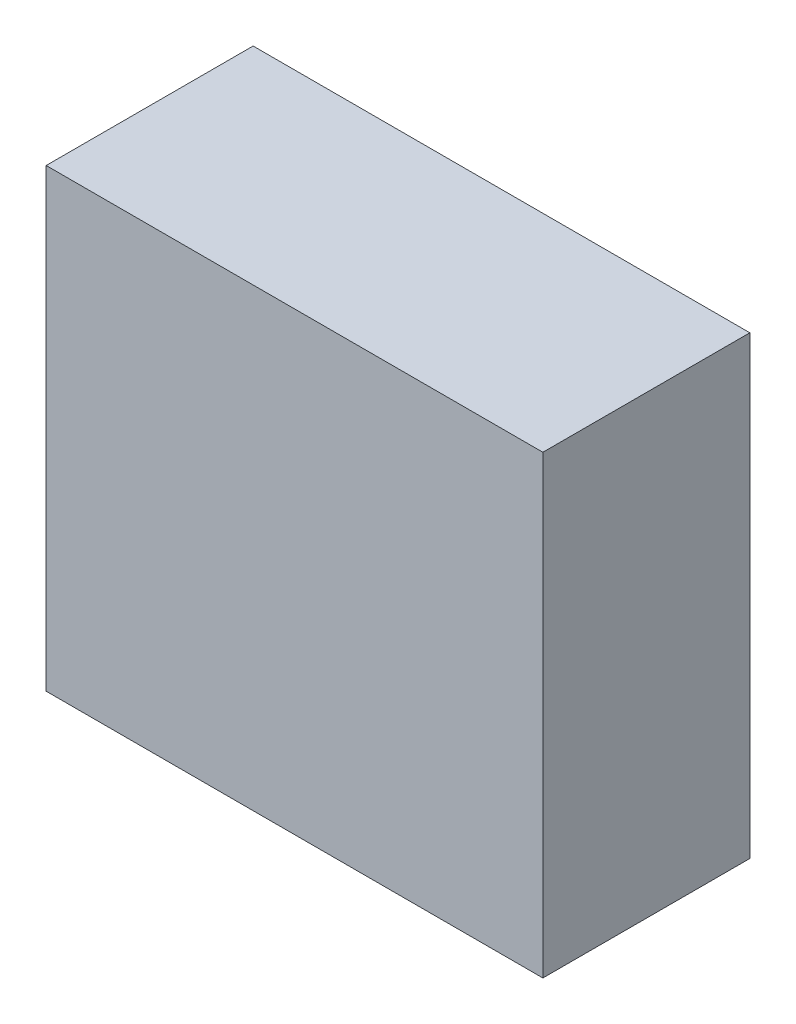
ISO-10303-21;
HEADER;
FILE_DESCRIPTION(('STEP AP214'),'2;1');
FILE_NAME('part.step','',(''),(''),'','','');
FILE_SCHEMA(('AUTOMOTIVE_DESIGN { 1 0 10303 214 1 1 1 1 }'));
ENDSEC;
DATA;
#1=APPLICATION_CONTEXT('core data for automotive mechanical design processes');
#2=APPLICATION_PROTOCOL_DEFINITION('international standard','automotive_design',2000,#1);
#3=PRODUCT_CONTEXT('',#1,'mechanical');
#4=PRODUCT('Part','Part','',(#3));
#5=PRODUCT_RELATED_PRODUCT_CATEGORY('part','',(#4));
#6=PRODUCT_DEFINITION_FORMATION('','',#4);
#7=PRODUCT_DEFINITION_CONTEXT('part definition',#1,'design');
#8=PRODUCT_DEFINITION('design','',#6,#7);
#9=PRODUCT_DEFINITION_SHAPE('','',#8);
#10=(LENGTH_UNIT() NAMED_UNIT(*) SI_UNIT(.MILLI.,.METRE.));
#11=(NAMED_UNIT(*) PLANE_ANGLE_UNIT() SI_UNIT($,.RADIAN.));
#12=(NAMED_UNIT(*) SI_UNIT($,.STERADIAN.) SOLID_ANGLE_UNIT());
#13=UNCERTAINTY_MEASURE_WITH_UNIT(LENGTH_MEASURE(1.E-05),#10,'distance_accuracy_value','');
#14=(GEOMETRIC_REPRESENTATION_CONTEXT(3) GLOBAL_UNCERTAINTY_ASSIGNED_CONTEXT((#13)) GLOBAL_UNIT_ASSIGNED_CONTEXT((#10,
#11,#12)) REPRESENTATION_CONTEXT('',''));
#15=CARTESIAN_POINT('',(0.,0.,0.));
#16=DIRECTION('',(0.,0.,1.));
#17=DIRECTION('',(1.,0.,0.));
#18=AXIS2_PLACEMENT_3D('',#15,#16,#17);
#19=CARTESIAN_POINT('',(850.,1690.,-700.));
#20=DIRECTION('',(-1.,0.,0.));
#21=DIRECTION('',(0.,0.,1.));
#22=AXIS2_PLACEMENT_3D('',#19,#20,#21);
#23=PLANE('',#22);
#24=DIRECTION('',(0.,-1.,0.));
#25=VECTOR('',#24,1.);
#26=CARTESIAN_POINT('',(850.,1690.,-650.));
#27=LINE('',#26,#25);
#28=CARTESIAN_POINT('',(850.,1800.,-650.));
#29=VERTEX_POINT('',#28);
#30=CARTESIAN_POINT('',(850.,1690.,-650.));
#31=VERTEX_POINT('',#30);
#32=EDGE_CURVE('E103',#29,#31,#27,.T.);
#33=ORIENTED_EDGE('',*,*,#32,.F.);
#34=DIRECTION('',(0.,0.,1.));
#35=VECTOR('',#34,1.);
#36=CARTESIAN_POINT('',(850.,1800.,-700.));
#37=LINE('',#36,#35);
#38=CARTESIAN_POINT('',(850.,1800.,-700.));
#39=VERTEX_POINT('',#38);
#40=EDGE_CURVE('E11',#39,#29,#37,.T.);
#41=ORIENTED_EDGE('',*,*,#40,.F.);
#42=DIRECTION('',(0.,-1.,0.));
#43=VECTOR('',#42,1.);
#44=CARTESIAN_POINT('',(850.,1690.,-700.));
#45=LINE('',#44,#43);
#46=CARTESIAN_POINT('',(850.,1690.,-700.));
#47=VERTEX_POINT('',#46);
#48=EDGE_CURVE('E97',#39,#47,#45,.T.);
#49=ORIENTED_EDGE('',*,*,#48,.T.);
#50=DIRECTION('',(0.,0.,1.));
#51=VECTOR('',#50,1.);
#52=CARTESIAN_POINT('',(850.,1690.,-700.));
#53=LINE('',#52,#51);
#54=EDGE_CURVE('E42',#47,#31,#53,.T.);
#55=ORIENTED_EDGE('',*,*,#54,.T.);
#56=EDGE_LOOP('',(#33,#41,#49,#55));
#57=FACE_BOUND('',#56,.T.);
#58=ADVANCED_FACE('F39',(#57),#23,.T.);
#59=CARTESIAN_POINT('',(850.,1800.,-700.));
#60=DIRECTION('',(0.,1.,0.));
#61=DIRECTION('',(0.,0.,1.));
#62=AXIS2_PLACEMENT_3D('',#59,#60,#61);
#63=PLANE('',#62);
#64=DIRECTION('',(-1.,0.,0.));
#65=VECTOR('',#64,1.);
#66=CARTESIAN_POINT('',(850.,1800.,-650.));
#67=LINE('',#66,#65);
#68=CARTESIAN_POINT('',(970.,1800.,-650.));
#69=VERTEX_POINT('',#68);
#70=EDGE_CURVE('E99',#69,#29,#67,.T.);
#71=ORIENTED_EDGE('',*,*,#70,.F.);
#72=DIRECTION('',(0.,0.,1.));
#73=VECTOR('',#72,1.);
#74=CARTESIAN_POINT('',(970.,1800.,-700.));
#75=LINE('',#74,#73);
#76=CARTESIAN_POINT('',(970.,1800.,-700.));
#77=VERTEX_POINT('',#76);
#78=EDGE_CURVE('E48',#77,#69,#75,.T.);
#79=ORIENTED_EDGE('',*,*,#78,.F.);
#80=DIRECTION('',(-1.,0.,0.));
#81=VECTOR('',#80,1.);
#82=CARTESIAN_POINT('',(850.,1800.,-700.));
#83=LINE('',#82,#81);
#84=EDGE_CURVE('E94',#77,#39,#83,.T.);
#85=ORIENTED_EDGE('',*,*,#84,.T.);
#86=ORIENTED_EDGE('',*,*,#40,.T.);
#87=EDGE_LOOP('',(#71,#79,#85,#86));
#88=FACE_BOUND('',#87,.T.);
#89=ADVANCED_FACE('F113',(#88),#63,.T.);
#90=CARTESIAN_POINT('',(970.,1690.,-700.));
#91=DIRECTION('',(1.,0.,0.));
#92=DIRECTION('',(0.,0.,-1.));
#93=AXIS2_PLACEMENT_3D('',#90,#91,#92);
#94=PLANE('',#93);
#95=DIRECTION('',(0.,1.,0.));
#96=VECTOR('',#95,1.);
#97=CARTESIAN_POINT('',(970.,1690.,-650.));
#98=LINE('',#97,#96);
#99=CARTESIAN_POINT('',(970.,1690.,-650.));
#100=VERTEX_POINT('',#99);
#101=EDGE_CURVE('E89',#100,#69,#98,.T.);
#102=ORIENTED_EDGE('',*,*,#101,.F.);
#103=DIRECTION('',(0.,0.,1.));
#104=VECTOR('',#103,1.);
#105=CARTESIAN_POINT('',(970.,1690.,-700.));
#106=LINE('',#105,#104);
#107=CARTESIAN_POINT('',(970.,1690.,-700.));
#108=VERTEX_POINT('',#107);
#109=EDGE_CURVE('E84',#108,#100,#106,.T.);
#110=ORIENTED_EDGE('',*,*,#109,.F.);
#111=DIRECTION('',(0.,1.,0.));
#112=VECTOR('',#111,1.);
#113=CARTESIAN_POINT('',(970.,1690.,-700.));
#114=LINE('',#113,#112);
#115=EDGE_CURVE('E87',#108,#77,#114,.T.);
#116=ORIENTED_EDGE('',*,*,#115,.T.);
#117=ORIENTED_EDGE('',*,*,#78,.T.);
#118=EDGE_LOOP('',(#102,#110,#116,#117));
#119=FACE_BOUND('',#118,.T.);
#120=ADVANCED_FACE('F86',(#119),#94,.T.);
#121=CARTESIAN_POINT('',(850.,1690.,-700.));
#122=DIRECTION('',(0.,-1.,0.));
#123=DIRECTION('',(0.,0.,-1.));
#124=AXIS2_PLACEMENT_3D('',#121,#122,#123);
#125=PLANE('',#124);
#126=DIRECTION('',(1.,0.,0.));
#127=VECTOR('',#126,1.);
#128=CARTESIAN_POINT('',(850.,1690.,-650.));
#129=LINE('',#128,#127);
#130=EDGE_CURVE('E106',#31,#100,#129,.T.);
#131=ORIENTED_EDGE('',*,*,#130,.F.);
#132=ORIENTED_EDGE('',*,*,#54,.F.);
#133=DIRECTION('',(1.,0.,0.));
#134=VECTOR('',#133,1.);
#135=CARTESIAN_POINT('',(850.,1690.,-700.));
#136=LINE('',#135,#134);
#137=EDGE_CURVE('E93',#47,#108,#136,.T.);
#138=ORIENTED_EDGE('',*,*,#137,.T.);
#139=ORIENTED_EDGE('',*,*,#109,.T.);
#140=EDGE_LOOP('',(#131,#132,#138,#139));
#141=FACE_BOUND('',#140,.T.);
#142=ADVANCED_FACE('F96',(#141),#125,.T.);
#143=CARTESIAN_POINT('',(0.,0.,-700.));
#144=DIRECTION('',(0.,0.,-1.));
#145=DIRECTION('',(-1.,0.,0.));
#146=AXIS2_PLACEMENT_3D('',#143,#144,#145);
#147=PLANE('',#146);
#148=ORIENTED_EDGE('',*,*,#48,.F.);
#149=ORIENTED_EDGE('',*,*,#84,.F.);
#150=ORIENTED_EDGE('',*,*,#115,.F.);
#151=ORIENTED_EDGE('',*,*,#137,.F.);
#152=EDGE_LOOP('',(#148,#149,#150,#151));
#153=FACE_BOUND('',#152,.T.);
#154=ADVANCED_FACE('F92',(#153),#147,.T.);
#155=CARTESIAN_POINT('',(0.,0.,-650.));
#156=DIRECTION('',(0.,0.,-1.));
#157=DIRECTION('',(-1.,0.,0.));
#158=AXIS2_PLACEMENT_3D('',#155,#156,#157);
#159=PLANE('',#158);
#160=ORIENTED_EDGE('',*,*,#32,.T.);
#161=ORIENTED_EDGE('',*,*,#130,.T.);
#162=ORIENTED_EDGE('',*,*,#101,.T.);
#163=ORIENTED_EDGE('',*,*,#70,.T.);
#164=EDGE_LOOP('',(#160,#161,#162,#163));
#165=FACE_BOUND('',#164,.T.);
#166=ADVANCED_FACE('F112',(#165),#159,.F.);
#167=CLOSED_SHELL('',(#58,#89,#120,#142,#154,#166));
#168=MANIFOLD_SOLID_BREP('B2',#167);
#169=ADVANCED_BREP_SHAPE_REPRESENTATION('',(#18,#168),#14);
#170=SHAPE_DEFINITION_REPRESENTATION(#9,#169);
ENDSEC;
END-ISO-10303-21;
